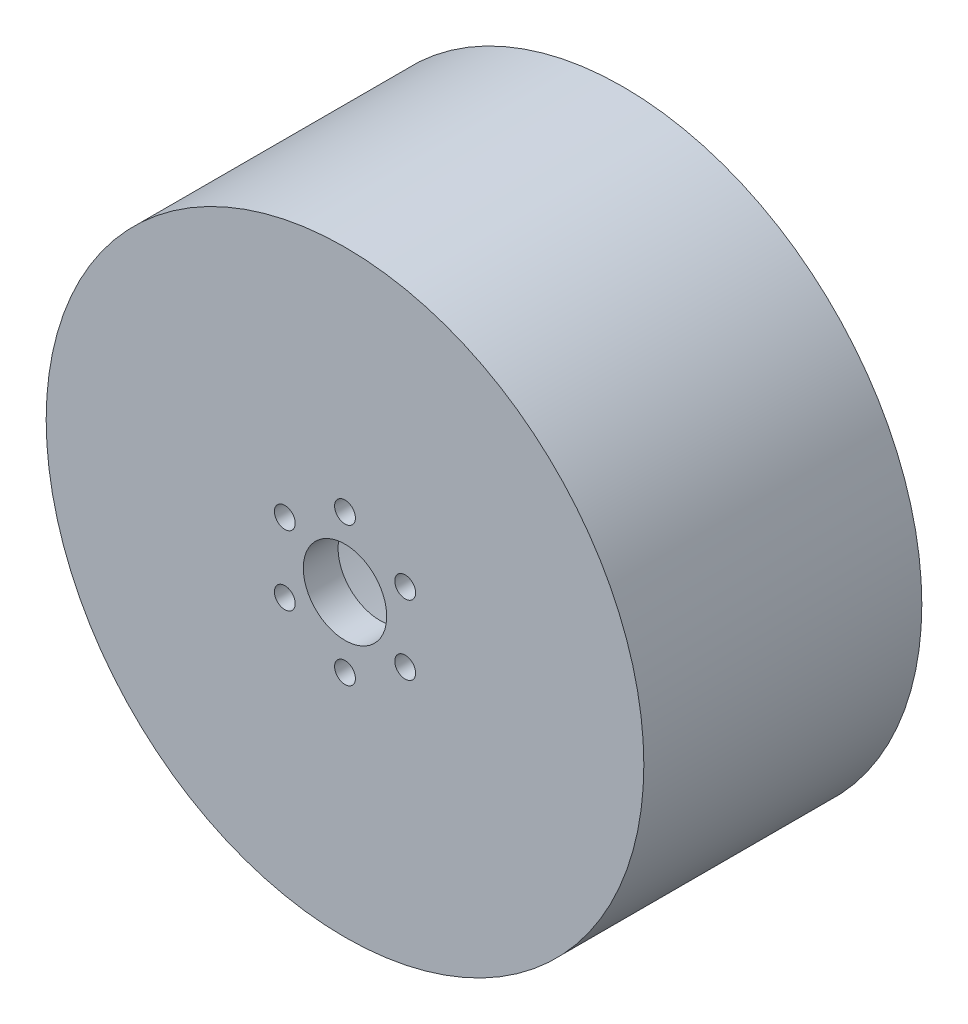
ISO-10303-21;
HEADER;
FILE_DESCRIPTION(('STEP AP214'),'2;1');
FILE_NAME('part.step','',(''),(''),'','','');
FILE_SCHEMA(('AUTOMOTIVE_DESIGN { 1 0 10303 214 1 1 1 1 }'));
ENDSEC;
DATA;
#1=APPLICATION_CONTEXT('core data for automotive mechanical design processes');
#2=APPLICATION_PROTOCOL_DEFINITION('international standard','automotive_design',2000,#1);
#3=PRODUCT_CONTEXT('',#1,'mechanical');
#4=PRODUCT('Part','Part','',(#3));
#5=PRODUCT_RELATED_PRODUCT_CATEGORY('part','',(#4));
#6=PRODUCT_DEFINITION_FORMATION('','',#4);
#7=PRODUCT_DEFINITION_CONTEXT('part definition',#1,'design');
#8=PRODUCT_DEFINITION('design','',#6,#7);
#9=PRODUCT_DEFINITION_SHAPE('','',#8);
#10=(LENGTH_UNIT() NAMED_UNIT(*) SI_UNIT(.MILLI.,.METRE.));
#11=(NAMED_UNIT(*) PLANE_ANGLE_UNIT() SI_UNIT($,.RADIAN.));
#12=(NAMED_UNIT(*) SI_UNIT($,.STERADIAN.) SOLID_ANGLE_UNIT());
#13=UNCERTAINTY_MEASURE_WITH_UNIT(LENGTH_MEASURE(1.E-05),#10,'distance_accuracy_value','');
#14=(GEOMETRIC_REPRESENTATION_CONTEXT(3) GLOBAL_UNCERTAINTY_ASSIGNED_CONTEXT((#13)) GLOBAL_UNIT_ASSIGNED_CONTEXT((#10,
#11,#12)) REPRESENTATION_CONTEXT('',''));
#15=CARTESIAN_POINT('',(0.,0.,0.));
#16=DIRECTION('',(0.,0.,1.));
#17=DIRECTION('',(1.,0.,0.));
#18=AXIS2_PLACEMENT_3D('',#15,#16,#17);
#19=CARTESIAN_POINT('',(0.,0.,40.));
#20=DIRECTION('',(0.,0.,-1.));
#21=DIRECTION('',(-1.,0.,0.));
#22=AXIS2_PLACEMENT_3D('',#19,#20,#21);
#23=CYLINDRICAL_SURFACE('',#22,40.);
#24=CARTESIAN_POINT('',(0.,0.,0.));
#25=DIRECTION('',(0.,0.,-1.));
#26=DIRECTION('',(-1.,0.,0.));
#27=AXIS2_PLACEMENT_3D('',#24,#25,#26);
#28=CIRCLE('',#27,40.);
#29=CARTESIAN_POINT('',(-40.,0.,0.));
#30=VERTEX_POINT('',#29);
#31=EDGE_CURVE('E18',#30,#30,#28,.T.);
#32=ORIENTED_EDGE('',*,*,#31,.T.);
#33=EDGE_LOOP('',(#32));
#34=FACE_BOUND('',#33,.T.);
#35=CARTESIAN_POINT('',(0.,0.,35.));
#36=DIRECTION('',(0.,0.,-1.));
#37=DIRECTION('',(-1.,0.,0.));
#38=AXIS2_PLACEMENT_3D('',#35,#36,#37);
#39=CIRCLE('',#38,40.);
#40=CARTESIAN_POINT('',(-40.,0.,35.));
#41=VERTEX_POINT('',#40);
#42=EDGE_CURVE('E70',#41,#41,#39,.F.);
#43=ORIENTED_EDGE('',*,*,#42,.T.);
#44=EDGE_LOOP('',(#43));
#45=FACE_BOUND('',#44,.T.);
#46=ADVANCED_FACE('F15',(#34,#45),#23,.F.);
#47=CARTESIAN_POINT('',(0.,0.,0.));
#48=DIRECTION('',(0.,0.,1.));
#49=DIRECTION('',(1.,0.,0.));
#50=AXIS2_PLACEMENT_3D('',#47,#48,#49);
#51=PLANE('',#50);
#52=ORIENTED_EDGE('',*,*,#31,.F.);
#53=EDGE_LOOP('',(#52));
#54=FACE_BOUND('',#53,.T.);
#55=CARTESIAN_POINT('',(0.,0.,0.));
#56=DIRECTION('',(0.,0.,-1.));
#57=DIRECTION('',(-1.,0.,0.));
#58=AXIS2_PLACEMENT_3D('',#55,#56,#57);
#59=CIRCLE('',#58,43.);
#60=CARTESIAN_POINT('',(-43.,0.,0.));
#61=VERTEX_POINT('',#60);
#62=EDGE_CURVE('E65',#61,#61,#59,.F.);
#63=ORIENTED_EDGE('',*,*,#62,.F.);
#64=EDGE_LOOP('',(#63));
#65=FACE_BOUND('',#64,.T.);
#66=ADVANCED_FACE('F78',(#54,#65),#51,.F.);
#67=CARTESIAN_POINT('',(0.,0.,35.));
#68=DIRECTION('',(0.,0.,1.));
#69=DIRECTION('',(1.,0.,0.));
#70=AXIS2_PLACEMENT_3D('',#67,#68,#69);
#71=PLANE('',#70);
#72=ORIENTED_EDGE('',*,*,#42,.F.);
#73=EDGE_LOOP('',(#72));
#74=FACE_BOUND('',#73,.T.);
#75=CARTESIAN_POINT('',(-8.66025403784433,5.0000000000001,35.));
#76=DIRECTION('',(0.,0.,1.));
#77=DIRECTION('',(1.,0.,0.));
#78=AXIS2_PLACEMENT_3D('',#75,#76,#77);
#79=CIRCLE('',#78,1.5);
#80=CARTESIAN_POINT('',(-7.16025403784433,5.0000000000001,35.));
#81=VERTEX_POINT('',#80);
#82=EDGE_CURVE('E47',#81,#81,#79,.T.);
#83=ORIENTED_EDGE('',*,*,#82,.T.);
#84=EDGE_LOOP('',(#83));
#85=FACE_BOUND('',#84,.T.);
#86=CARTESIAN_POINT('',(0.,10.,35.));
#87=DIRECTION('',(0.,0.,1.));
#88=DIRECTION('',(1.,0.,0.));
#89=AXIS2_PLACEMENT_3D('',#86,#87,#88);
#90=CIRCLE('',#89,1.5);
#91=CARTESIAN_POINT('',(1.5,10.,35.));
#92=VERTEX_POINT('',#91);
#93=EDGE_CURVE('E50',#92,#92,#90,.T.);
#94=ORIENTED_EDGE('',*,*,#93,.T.);
#95=EDGE_LOOP('',(#94));
#96=FACE_BOUND('',#95,.T.);
#97=CARTESIAN_POINT('',(8.6602540378444,4.99999999999998,35.));
#98=DIRECTION('',(0.,0.,1.));
#99=DIRECTION('',(1.,0.,0.));
#100=AXIS2_PLACEMENT_3D('',#97,#98,#99);
#101=CIRCLE('',#100,1.5);
#102=CARTESIAN_POINT('',(10.1602540378444,4.99999999999998,35.));
#103=VERTEX_POINT('',#102);
#104=EDGE_CURVE('E53',#103,#103,#101,.T.);
#105=ORIENTED_EDGE('',*,*,#104,.T.);
#106=EDGE_LOOP('',(#105));
#107=FACE_BOUND('',#106,.T.);
#108=CARTESIAN_POINT('',(8.66025403784524,-4.99999999999951,35.));
#109=DIRECTION('',(0.,0.,1.));
#110=DIRECTION('',(1.,0.,0.));
#111=AXIS2_PLACEMENT_3D('',#108,#109,#110);
#112=CIRCLE('',#111,1.50000000000071);
#113=CARTESIAN_POINT('',(10.160254037846,-4.99999999999951,35.));
#114=VERTEX_POINT('',#113);
#115=EDGE_CURVE('E56',#114,#114,#112,.T.);
#116=ORIENTED_EDGE('',*,*,#115,.T.);
#117=EDGE_LOOP('',(#116));
#118=FACE_BOUND('',#117,.T.);
#119=CARTESIAN_POINT('',(1.13319443681872E-12,-10.,35.));
#120=DIRECTION('',(0.,0.,1.));
#121=DIRECTION('',(1.,0.,0.));
#122=AXIS2_PLACEMENT_3D('',#119,#120,#121);
#123=CIRCLE('',#122,1.50000000000115);
#124=CARTESIAN_POINT('',(1.50000000000228,-10.,35.));
#125=VERTEX_POINT('',#124);
#126=EDGE_CURVE('E59',#125,#125,#123,.T.);
#127=ORIENTED_EDGE('',*,*,#126,.T.);
#128=EDGE_LOOP('',(#127));
#129=FACE_BOUND('',#128,.T.);
#130=CARTESIAN_POINT('',(-8.66025403784354,-5.00000000000049,35.));
#131=DIRECTION('',(0.,0.,1.));
#132=DIRECTION('',(1.,0.,0.));
#133=AXIS2_PLACEMENT_3D('',#130,#131,#132);
#134=CIRCLE('',#133,1.50000000000104);
#135=CARTESIAN_POINT('',(-7.16025403784249,-5.00000000000049,35.));
#136=VERTEX_POINT('',#135);
#137=EDGE_CURVE('E62',#136,#136,#134,.T.);
#138=ORIENTED_EDGE('',*,*,#137,.T.);
#139=EDGE_LOOP('',(#138));
#140=FACE_BOUND('',#139,.T.);
#141=CARTESIAN_POINT('',(0.,0.,35.));
#142=DIRECTION('',(0.,0.,-1.));
#143=DIRECTION('',(-1.,0.,0.));
#144=AXIS2_PLACEMENT_3D('',#141,#142,#143);
#145=CIRCLE('',#144,6.);
#146=CARTESIAN_POINT('',(-6.,0.,35.));
#147=VERTEX_POINT('',#146);
#148=EDGE_CURVE('E68',#147,#147,#145,.F.);
#149=ORIENTED_EDGE('',*,*,#148,.T.);
#150=EDGE_LOOP('',(#149));
#151=FACE_BOUND('',#150,.T.);
#152=ADVANCED_FACE('F81',(#74,#85,#96,#107,#118,#129,#140,#151),#71,.F.);
#153=CARTESIAN_POINT('',(0.,0.,45.));
#154=DIRECTION('',(0.,0.,-1.));
#155=DIRECTION('',(-1.,0.,0.));
#156=AXIS2_PLACEMENT_3D('',#153,#154,#155);
#157=CYLINDRICAL_SURFACE('',#156,6.);
#158=CARTESIAN_POINT('',(0.,0.,40.));
#159=DIRECTION('',(0.,0.,-1.));
#160=DIRECTION('',(-1.,0.,0.));
#161=AXIS2_PLACEMENT_3D('',#158,#159,#160);
#162=CIRCLE('',#161,6.);
#163=CARTESIAN_POINT('',(-6.,0.,40.));
#164=VERTEX_POINT('',#163);
#165=EDGE_CURVE('E44',#164,#164,#162,.T.);
#166=ORIENTED_EDGE('',*,*,#165,.F.);
#167=EDGE_LOOP('',(#166));
#168=FACE_BOUND('',#167,.T.);
#169=ORIENTED_EDGE('',*,*,#148,.F.);
#170=EDGE_LOOP('',(#169));
#171=FACE_BOUND('',#170,.T.);
#172=ADVANCED_FACE('F88',(#168,#171),#157,.F.);
#173=CARTESIAN_POINT('',(0.,0.,40.));
#174=DIRECTION('',(0.,0.,-1.));
#175=DIRECTION('',(-1.,0.,0.));
#176=AXIS2_PLACEMENT_3D('',#173,#174,#175);
#177=CYLINDRICAL_SURFACE('',#176,43.);
#178=ORIENTED_EDGE('',*,*,#62,.T.);
#179=EDGE_LOOP('',(#178));
#180=FACE_BOUND('',#179,.T.);
#181=CARTESIAN_POINT('',(0.,0.,40.));
#182=DIRECTION('',(0.,0.,-1.));
#183=DIRECTION('',(-1.,0.,0.));
#184=AXIS2_PLACEMENT_3D('',#181,#182,#183);
#185=CIRCLE('',#184,43.);
#186=CARTESIAN_POINT('',(-43.,0.,40.));
#187=VERTEX_POINT('',#186);
#188=EDGE_CURVE('E41',#187,#187,#185,.F.);
#189=ORIENTED_EDGE('',*,*,#188,.F.);
#190=EDGE_LOOP('',(#189));
#191=FACE_BOUND('',#190,.T.);
#192=ADVANCED_FACE('F84',(#180,#191),#177,.T.);
#193=CARTESIAN_POINT('',(-8.66025403784354,-5.00000000000049,35.));
#194=DIRECTION('',(0.,0.,1.));
#195=DIRECTION('',(1.,0.,0.));
#196=AXIS2_PLACEMENT_3D('',#193,#194,#195);
#197=CYLINDRICAL_SURFACE('',#196,1.50000000000104);
#198=CARTESIAN_POINT('',(-8.66025403784354,-5.00000000000049,40.));
#199=DIRECTION('',(0.,0.,1.));
#200=DIRECTION('',(1.,0.,0.));
#201=AXIS2_PLACEMENT_3D('',#198,#199,#200);
#202=CIRCLE('',#201,1.50000000000104);
#203=CARTESIAN_POINT('',(-7.16025403784249,-5.00000000000049,40.));
#204=VERTEX_POINT('',#203);
#205=EDGE_CURVE('E38',#204,#204,#202,.F.);
#206=ORIENTED_EDGE('',*,*,#205,.F.);
#207=EDGE_LOOP('',(#206));
#208=FACE_BOUND('',#207,.T.);
#209=ORIENTED_EDGE('',*,*,#137,.F.);
#210=EDGE_LOOP('',(#209));
#211=FACE_BOUND('',#210,.T.);
#212=ADVANCED_FACE('F87',(#208,#211),#197,.F.);
#213=CARTESIAN_POINT('',(1.13319443681872E-12,-10.,35.));
#214=DIRECTION('',(0.,0.,1.));
#215=DIRECTION('',(1.,0.,0.));
#216=AXIS2_PLACEMENT_3D('',#213,#214,#215);
#217=CYLINDRICAL_SURFACE('',#216,1.50000000000115);
#218=CARTESIAN_POINT('',(1.13319443681872E-12,-10.,40.));
#219=DIRECTION('',(0.,0.,1.));
#220=DIRECTION('',(1.,0.,0.));
#221=AXIS2_PLACEMENT_3D('',#218,#219,#220);
#222=CIRCLE('',#221,1.50000000000115);
#223=CARTESIAN_POINT('',(1.50000000000228,-10.,40.));
#224=VERTEX_POINT('',#223);
#225=EDGE_CURVE('E35',#224,#224,#222,.F.);
#226=ORIENTED_EDGE('',*,*,#225,.F.);
#227=EDGE_LOOP('',(#226));
#228=FACE_BOUND('',#227,.T.);
#229=ORIENTED_EDGE('',*,*,#126,.F.);
#230=EDGE_LOOP('',(#229));
#231=FACE_BOUND('',#230,.T.);
#232=ADVANCED_FACE('F114',(#228,#231),#217,.F.);
#233=CARTESIAN_POINT('',(8.66025403784524,-4.99999999999951,35.));
#234=DIRECTION('',(0.,0.,1.));
#235=DIRECTION('',(1.,0.,0.));
#236=AXIS2_PLACEMENT_3D('',#233,#234,#235);
#237=CYLINDRICAL_SURFACE('',#236,1.50000000000071);
#238=CARTESIAN_POINT('',(8.66025403784524,-4.99999999999951,40.));
#239=DIRECTION('',(0.,0.,1.));
#240=DIRECTION('',(1.,0.,0.));
#241=AXIS2_PLACEMENT_3D('',#238,#239,#240);
#242=CIRCLE('',#241,1.50000000000071);
#243=CARTESIAN_POINT('',(10.160254037846,-4.99999999999951,40.));
#244=VERTEX_POINT('',#243);
#245=EDGE_CURVE('E32',#244,#244,#242,.F.);
#246=ORIENTED_EDGE('',*,*,#245,.F.);
#247=EDGE_LOOP('',(#246));
#248=FACE_BOUND('',#247,.T.);
#249=ORIENTED_EDGE('',*,*,#115,.F.);
#250=EDGE_LOOP('',(#249));
#251=FACE_BOUND('',#250,.T.);
#252=ADVANCED_FACE('F118',(#248,#251),#237,.F.);
#253=CARTESIAN_POINT('',(8.6602540378444,4.99999999999998,35.));
#254=DIRECTION('',(0.,0.,1.));
#255=DIRECTION('',(1.,0.,0.));
#256=AXIS2_PLACEMENT_3D('',#253,#254,#255);
#257=CYLINDRICAL_SURFACE('',#256,1.5);
#258=CARTESIAN_POINT('',(8.6602540378444,4.99999999999998,40.));
#259=DIRECTION('',(0.,0.,1.));
#260=DIRECTION('',(1.,0.,0.));
#261=AXIS2_PLACEMENT_3D('',#258,#259,#260);
#262=CIRCLE('',#261,1.5);
#263=CARTESIAN_POINT('',(10.1602540378444,4.99999999999998,40.));
#264=VERTEX_POINT('',#263);
#265=EDGE_CURVE('E27',#264,#264,#262,.F.);
#266=ORIENTED_EDGE('',*,*,#265,.F.);
#267=EDGE_LOOP('',(#266));
#268=FACE_BOUND('',#267,.T.);
#269=ORIENTED_EDGE('',*,*,#104,.F.);
#270=EDGE_LOOP('',(#269));
#271=FACE_BOUND('',#270,.T.);
#272=ADVANCED_FACE('F122',(#268,#271),#257,.F.);
#273=CARTESIAN_POINT('',(0.,10.,35.));
#274=DIRECTION('',(0.,0.,1.));
#275=DIRECTION('',(1.,0.,0.));
#276=AXIS2_PLACEMENT_3D('',#273,#274,#275);
#277=CYLINDRICAL_SURFACE('',#276,1.5);
#278=CARTESIAN_POINT('',(0.,10.,40.));
#279=DIRECTION('',(0.,0.,1.));
#280=DIRECTION('',(1.,0.,0.));
#281=AXIS2_PLACEMENT_3D('',#278,#279,#280);
#282=CIRCLE('',#281,1.5);
#283=CARTESIAN_POINT('',(1.5,10.,40.));
#284=VERTEX_POINT('',#283);
#285=EDGE_CURVE('E22',#284,#284,#282,.F.);
#286=ORIENTED_EDGE('',*,*,#285,.F.);
#287=EDGE_LOOP('',(#286));
#288=FACE_BOUND('',#287,.T.);
#289=ORIENTED_EDGE('',*,*,#93,.F.);
#290=EDGE_LOOP('',(#289));
#291=FACE_BOUND('',#290,.T.);
#292=ADVANCED_FACE('F126',(#288,#291),#277,.F.);
#293=CARTESIAN_POINT('',(-8.66025403784433,5.0000000000001,35.));
#294=DIRECTION('',(0.,0.,1.));
#295=DIRECTION('',(1.,0.,0.));
#296=AXIS2_PLACEMENT_3D('',#293,#294,#295);
#297=CYLINDRICAL_SURFACE('',#296,1.5);
#298=CARTESIAN_POINT('',(-8.66025403784433,5.0000000000001,40.));
#299=DIRECTION('',(0.,0.,1.));
#300=DIRECTION('',(1.,0.,0.));
#301=AXIS2_PLACEMENT_3D('',#298,#299,#300);
#302=CIRCLE('',#301,1.5);
#303=CARTESIAN_POINT('',(-7.16025403784433,5.0000000000001,40.));
#304=VERTEX_POINT('',#303);
#305=EDGE_CURVE('E10',#304,#304,#302,.F.);
#306=ORIENTED_EDGE('',*,*,#305,.F.);
#307=EDGE_LOOP('',(#306));
#308=FACE_BOUND('',#307,.T.);
#309=ORIENTED_EDGE('',*,*,#82,.F.);
#310=EDGE_LOOP('',(#309));
#311=FACE_BOUND('',#310,.T.);
#312=ADVANCED_FACE('F95',(#308,#311),#297,.F.);
#313=CARTESIAN_POINT('',(0.,0.,40.));
#314=DIRECTION('',(0.,0.,1.));
#315=DIRECTION('',(1.,0.,0.));
#316=AXIS2_PLACEMENT_3D('',#313,#314,#315);
#317=PLANE('',#316);
#318=ORIENTED_EDGE('',*,*,#305,.T.);
#319=EDGE_LOOP('',(#318));
#320=FACE_BOUND('',#319,.T.);
#321=ORIENTED_EDGE('',*,*,#285,.T.);
#322=EDGE_LOOP('',(#321));
#323=FACE_BOUND('',#322,.T.);
#324=ORIENTED_EDGE('',*,*,#265,.T.);
#325=EDGE_LOOP('',(#324));
#326=FACE_BOUND('',#325,.T.);
#327=ORIENTED_EDGE('',*,*,#245,.T.);
#328=EDGE_LOOP('',(#327));
#329=FACE_BOUND('',#328,.T.);
#330=ORIENTED_EDGE('',*,*,#225,.T.);
#331=EDGE_LOOP('',(#330));
#332=FACE_BOUND('',#331,.T.);
#333=ORIENTED_EDGE('',*,*,#205,.T.);
#334=EDGE_LOOP('',(#333));
#335=FACE_BOUND('',#334,.T.);
#336=ORIENTED_EDGE('',*,*,#188,.T.);
#337=EDGE_LOOP('',(#336));
#338=FACE_BOUND('',#337,.T.);
#339=ORIENTED_EDGE('',*,*,#165,.T.);
#340=EDGE_LOOP('',(#339));
#341=FACE_BOUND('',#340,.T.);
#342=ADVANCED_FACE('F92',(#320,#323,#326,#329,#332,#335,#338,#341),#317,.T.);
#343=CLOSED_SHELL('',(#46,#66,#152,#172,#192,#212,#232,#252,#272,#292,#312,#342));
#344=MANIFOLD_SOLID_BREP('B1',#343);
#345=ADVANCED_BREP_SHAPE_REPRESENTATION('',(#18,#344),#14);
#346=SHAPE_DEFINITION_REPRESENTATION(#9,#345);
ENDSEC;
END-ISO-10303-21;
